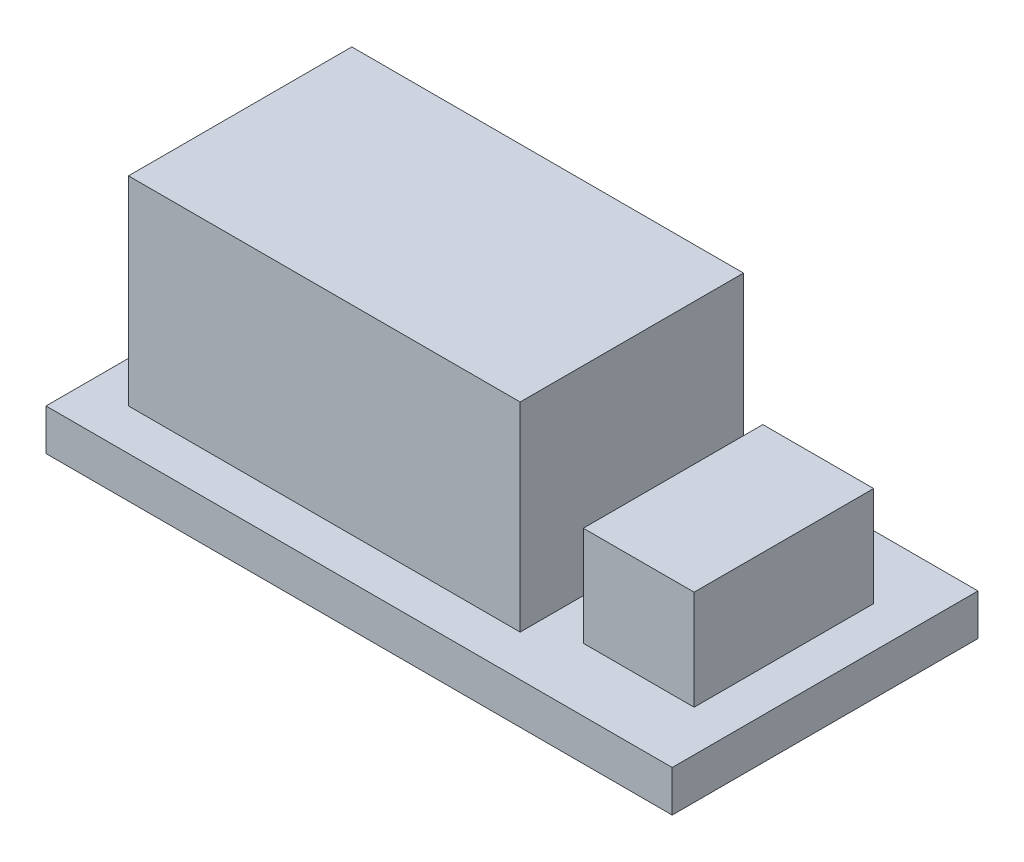
ISO-10303-21;
HEADER;
FILE_DESCRIPTION(('STEP AP214'),'2;1');
FILE_NAME('part.step','',(''),(''),'','','');
FILE_SCHEMA(('AUTOMOTIVE_DESIGN { 1 0 10303 214 1 1 1 1 }'));
ENDSEC;
DATA;
#1=APPLICATION_CONTEXT('core data for automotive mechanical design processes');
#2=APPLICATION_PROTOCOL_DEFINITION('international standard','automotive_design',2000,#1);
#3=PRODUCT_CONTEXT('',#1,'mechanical');
#4=PRODUCT('Part','Part','',(#3));
#5=PRODUCT_RELATED_PRODUCT_CATEGORY('part','',(#4));
#6=PRODUCT_DEFINITION_FORMATION('','',#4);
#7=PRODUCT_DEFINITION_CONTEXT('part definition',#1,'design');
#8=PRODUCT_DEFINITION('design','',#6,#7);
#9=PRODUCT_DEFINITION_SHAPE('','',#8);
#10=(LENGTH_UNIT() NAMED_UNIT(*) SI_UNIT(.MILLI.,.METRE.));
#11=(NAMED_UNIT(*) PLANE_ANGLE_UNIT() SI_UNIT($,.RADIAN.));
#12=(NAMED_UNIT(*) SI_UNIT($,.STERADIAN.) SOLID_ANGLE_UNIT());
#13=UNCERTAINTY_MEASURE_WITH_UNIT(LENGTH_MEASURE(1.E-05),#10,'distance_accuracy_value','');
#14=(GEOMETRIC_REPRESENTATION_CONTEXT(3) GLOBAL_UNCERTAINTY_ASSIGNED_CONTEXT((#13)) GLOBAL_UNIT_ASSIGNED_CONTEXT((#10,
#11,#12)) REPRESENTATION_CONTEXT('',''));
#15=CARTESIAN_POINT('',(0.,0.,0.));
#16=DIRECTION('',(0.,0.,1.));
#17=DIRECTION('',(1.,0.,0.));
#18=AXIS2_PLACEMENT_3D('',#15,#16,#17);
#19=CARTESIAN_POINT('',(2876.55,-304.8,1130.3));
#20=DIRECTION('',(-1.,0.,0.));
#21=DIRECTION('',(0.,0.,1.));
#22=AXIS2_PLACEMENT_3D('',#19,#20,#21);
#23=PLANE('',#22);
#24=DIRECTION('',(0.,0.,1.));
#25=VECTOR('',#24,1.);
#26=CARTESIAN_POINT('',(2876.55,0.,1130.3));
#27=LINE('',#26,#25);
#28=CARTESIAN_POINT('',(2876.55,0.,-1130.3));
#29=VERTEX_POINT('',#28);
#30=CARTESIAN_POINT('',(2876.55,0.,1130.3));
#31=VERTEX_POINT('',#30);
#32=EDGE_CURVE('E115',#29,#31,#27,.T.);
#33=ORIENTED_EDGE('',*,*,#32,.T.);
#34=DIRECTION('',(0.,1.,0.));
#35=VECTOR('',#34,1.);
#36=CARTESIAN_POINT('',(2876.55,-304.8,1130.3));
#37=LINE('',#36,#35);
#38=CARTESIAN_POINT('',(2876.55,-304.8,1130.3));
#39=VERTEX_POINT('',#38);
#40=EDGE_CURVE('E12',#39,#31,#37,.T.);
#41=ORIENTED_EDGE('',*,*,#40,.F.);
#42=DIRECTION('',(0.,0.,1.));
#43=VECTOR('',#42,1.);
#44=CARTESIAN_POINT('',(2876.55,-304.8,1130.3));
#45=LINE('',#44,#43);
#46=CARTESIAN_POINT('',(2876.55,-304.8,-1130.3));
#47=VERTEX_POINT('',#46);
#48=EDGE_CURVE('E103',#47,#39,#45,.T.);
#49=ORIENTED_EDGE('',*,*,#48,.F.);
#50=DIRECTION('',(0.,1.,0.));
#51=VECTOR('',#50,1.);
#52=CARTESIAN_POINT('',(2876.55,-304.8,-1130.3));
#53=LINE('',#52,#51);
#54=EDGE_CURVE('E111',#47,#29,#53,.T.);
#55=ORIENTED_EDGE('',*,*,#54,.T.);
#56=EDGE_LOOP('',(#33,#41,#49,#55));
#57=FACE_BOUND('',#56,.T.);
#58=ADVANCED_FACE('F52',(#57),#23,.F.);
#59=CARTESIAN_POINT('',(-1752.6,-304.8,1130.3));
#60=DIRECTION('',(0.,0.,-1.));
#61=DIRECTION('',(-1.,0.,0.));
#62=AXIS2_PLACEMENT_3D('',#59,#60,#61);
#63=PLANE('',#62);
#64=DIRECTION('',(-1.,0.,0.));
#65=VECTOR('',#64,1.);
#66=CARTESIAN_POINT('',(-1752.6,0.,1130.3));
#67=LINE('',#66,#65);
#68=CARTESIAN_POINT('',(-1752.6,0.,1130.3));
#69=VERTEX_POINT('',#68);
#70=EDGE_CURVE('E107',#31,#69,#67,.T.);
#71=ORIENTED_EDGE('',*,*,#70,.T.);
#72=DIRECTION('',(0.,1.,0.));
#73=VECTOR('',#72,1.);
#74=CARTESIAN_POINT('',(-1752.6,-304.8,1130.3));
#75=LINE('',#74,#73);
#76=CARTESIAN_POINT('',(-1752.6,-304.8,1130.3));
#77=VERTEX_POINT('',#76);
#78=EDGE_CURVE('E60',#77,#69,#75,.T.);
#79=ORIENTED_EDGE('',*,*,#78,.F.);
#80=DIRECTION('',(-1.,0.,0.));
#81=VECTOR('',#80,1.);
#82=CARTESIAN_POINT('',(-1752.6,-304.8,1130.3));
#83=LINE('',#82,#81);
#84=EDGE_CURVE('E98',#39,#77,#83,.T.);
#85=ORIENTED_EDGE('',*,*,#84,.F.);
#86=ORIENTED_EDGE('',*,*,#40,.T.);
#87=EDGE_LOOP('',(#71,#79,#85,#86));
#88=FACE_BOUND('',#87,.T.);
#89=ADVANCED_FACE('F106',(#88),#63,.F.);
#90=CARTESIAN_POINT('',(-1752.6,-304.8,1130.3));
#91=DIRECTION('',(1.,0.,0.));
#92=DIRECTION('',(0.,0.,-1.));
#93=AXIS2_PLACEMENT_3D('',#90,#91,#92);
#94=PLANE('',#93);
#95=DIRECTION('',(0.,0.,-1.));
#96=VECTOR('',#95,1.);
#97=CARTESIAN_POINT('',(-1752.6,0.,1130.3));
#98=LINE('',#97,#96);
#99=CARTESIAN_POINT('',(-1752.6,0.,-1130.3));
#100=VERTEX_POINT('',#99);
#101=EDGE_CURVE('E85',#69,#100,#98,.T.);
#102=ORIENTED_EDGE('',*,*,#101,.T.);
#103=DIRECTION('',(0.,1.,0.));
#104=VECTOR('',#103,1.);
#105=CARTESIAN_POINT('',(-1752.6,-304.8,-1130.3));
#106=LINE('',#105,#104);
#107=CARTESIAN_POINT('',(-1752.6,-304.8,-1130.3));
#108=VERTEX_POINT('',#107);
#109=EDGE_CURVE('E108',#108,#100,#106,.T.);
#110=ORIENTED_EDGE('',*,*,#109,.F.);
#111=DIRECTION('',(0.,0.,-1.));
#112=VECTOR('',#111,1.);
#113=CARTESIAN_POINT('',(-1752.6,-304.8,1130.3));
#114=LINE('',#113,#112);
#115=EDGE_CURVE('E101',#77,#108,#114,.T.);
#116=ORIENTED_EDGE('',*,*,#115,.F.);
#117=ORIENTED_EDGE('',*,*,#78,.T.);
#118=EDGE_LOOP('',(#102,#110,#116,#117));
#119=FACE_BOUND('',#118,.T.);
#120=ADVANCED_FACE('F109',(#119),#94,.F.);
#121=CARTESIAN_POINT('',(-1752.6,-304.8,-1130.3));
#122=DIRECTION('',(0.,0.,1.));
#123=DIRECTION('',(1.,0.,0.));
#124=AXIS2_PLACEMENT_3D('',#121,#122,#123);
#125=PLANE('',#124);
#126=DIRECTION('',(1.,0.,0.));
#127=VECTOR('',#126,1.);
#128=CARTESIAN_POINT('',(-1752.6,0.,-1130.3));
#129=LINE('',#128,#127);
#130=EDGE_CURVE('E91',#100,#29,#129,.T.);
#131=ORIENTED_EDGE('',*,*,#130,.T.);
#132=ORIENTED_EDGE('',*,*,#54,.F.);
#133=DIRECTION('',(1.,0.,0.));
#134=VECTOR('',#133,1.);
#135=CARTESIAN_POINT('',(-1752.6,-304.8,-1130.3));
#136=LINE('',#135,#134);
#137=EDGE_CURVE('E68',#108,#47,#136,.T.);
#138=ORIENTED_EDGE('',*,*,#137,.F.);
#139=ORIENTED_EDGE('',*,*,#109,.T.);
#140=EDGE_LOOP('',(#131,#132,#138,#139));
#141=FACE_BOUND('',#140,.T.);
#142=ADVANCED_FACE('F122',(#141),#125,.F.);
#143=CARTESIAN_POINT('',(0.,-304.8,0.));
#144=DIRECTION('',(0.,-1.,0.));
#145=DIRECTION('',(0.,0.,-1.));
#146=AXIS2_PLACEMENT_3D('',#143,#144,#145);
#147=PLANE('',#146);
#148=ORIENTED_EDGE('',*,*,#48,.T.);
#149=ORIENTED_EDGE('',*,*,#84,.T.);
#150=ORIENTED_EDGE('',*,*,#115,.T.);
#151=ORIENTED_EDGE('',*,*,#137,.T.);
#152=EDGE_LOOP('',(#148,#149,#150,#151));
#153=FACE_BOUND('',#152,.T.);
#154=ADVANCED_FACE('F99',(#153),#147,.T.);
#155=CARTESIAN_POINT('',(0.,0.,0.));
#156=DIRECTION('',(0.,-1.,0.));
#157=DIRECTION('',(0.,0.,-1.));
#158=AXIS2_PLACEMENT_3D('',#155,#156,#157);
#159=PLANE('',#158);
#160=ORIENTED_EDGE('',*,*,#32,.F.);
#161=ORIENTED_EDGE('',*,*,#130,.F.);
#162=ORIENTED_EDGE('',*,*,#101,.F.);
#163=ORIENTED_EDGE('',*,*,#70,.F.);
#164=EDGE_LOOP('',(#160,#161,#162,#163));
#165=FACE_BOUND('',#164,.T.);
#166=ADVANCED_FACE('F125',(#165),#159,.F.);
#167=CLOSED_SHELL('',(#58,#89,#120,#142,#154,#166));
#168=MANIFOLD_SOLID_BREP('B2',#167);
#169=CARTESIAN_POINT('',(2571.75,736.6,663.575000000001));
#170=DIRECTION('',(1.,0.,0.));
#171=DIRECTION('',(0.,0.,-1.));
#172=AXIS2_PLACEMENT_3D('',#169,#170,#171);
#173=PLANE('',#172);
#174=DIRECTION('',(0.,0.,1.));
#175=VECTOR('',#174,1.);
#176=CARTESIAN_POINT('',(2571.75,0.,663.575000000001));
#177=LINE('',#176,#175);
#178=CARTESIAN_POINT('',(2571.75,0.,-663.575));
#179=VERTEX_POINT('',#178);
#180=CARTESIAN_POINT('',(2571.75,0.,663.575000000001));
#181=VERTEX_POINT('',#180);
#182=EDGE_CURVE('E251',#179,#181,#177,.T.);
#183=ORIENTED_EDGE('',*,*,#182,.F.);
#184=DIRECTION('',(0.,-1.,0.));
#185=VECTOR('',#184,1.);
#186=CARTESIAN_POINT('',(2571.75,736.6,-663.575));
#187=LINE('',#186,#185);
#188=CARTESIAN_POINT('',(2571.75,736.6,-663.575));
#189=VERTEX_POINT('',#188);
#190=EDGE_CURVE('E50',#189,#179,#187,.T.);
#191=ORIENTED_EDGE('',*,*,#190,.F.);
#192=DIRECTION('',(0.,0.,1.));
#193=VECTOR('',#192,1.);
#194=CARTESIAN_POINT('',(2571.75,736.6,663.575000000001));
#195=LINE('',#194,#193);
#196=CARTESIAN_POINT('',(2571.75,736.6,663.575000000001));
#197=VERTEX_POINT('',#196);
#198=EDGE_CURVE('E245',#189,#197,#195,.T.);
#199=ORIENTED_EDGE('',*,*,#198,.T.);
#200=DIRECTION('',(0.,-1.,0.));
#201=VECTOR('',#200,1.);
#202=CARTESIAN_POINT('',(2571.75,736.6,663.575000000001));
#203=LINE('',#202,#201);
#204=EDGE_CURVE('E190',#197,#181,#203,.T.);
#205=ORIENTED_EDGE('',*,*,#204,.T.);
#206=EDGE_LOOP('',(#183,#191,#199,#205));
#207=FACE_BOUND('',#206,.T.);
#208=ADVANCED_FACE('F187',(#207),#173,.T.);
#209=CARTESIAN_POINT('',(1752.6,736.6,-663.575));
#210=DIRECTION('',(0.,0.,-1.));
#211=DIRECTION('',(-1.,0.,0.));
#212=AXIS2_PLACEMENT_3D('',#209,#210,#211);
#213=PLANE('',#212);
#214=DIRECTION('',(1.,0.,0.));
#215=VECTOR('',#214,1.);
#216=CARTESIAN_POINT('',(1752.6,0.,-663.575));
#217=LINE('',#216,#215);
#218=CARTESIAN_POINT('',(1752.6,0.,-663.575));
#219=VERTEX_POINT('',#218);
#220=EDGE_CURVE('E247',#219,#179,#217,.T.);
#221=ORIENTED_EDGE('',*,*,#220,.F.);
#222=DIRECTION('',(0.,-1.,0.));
#223=VECTOR('',#222,1.);
#224=CARTESIAN_POINT('',(1752.6,736.6,-663.575));
#225=LINE('',#224,#223);
#226=CARTESIAN_POINT('',(1752.6,736.6,-663.575));
#227=VERTEX_POINT('',#226);
#228=EDGE_CURVE('E196',#227,#219,#225,.T.);
#229=ORIENTED_EDGE('',*,*,#228,.F.);
#230=DIRECTION('',(1.,0.,0.));
#231=VECTOR('',#230,1.);
#232=CARTESIAN_POINT('',(1752.6,736.6,-663.575));
#233=LINE('',#232,#231);
#234=EDGE_CURVE('E242',#227,#189,#233,.T.);
#235=ORIENTED_EDGE('',*,*,#234,.T.);
#236=ORIENTED_EDGE('',*,*,#190,.T.);
#237=EDGE_LOOP('',(#221,#229,#235,#236));
#238=FACE_BOUND('',#237,.T.);
#239=ADVANCED_FACE('F261',(#238),#213,.T.);
#240=CARTESIAN_POINT('',(1752.6,736.6,663.575));
#241=DIRECTION('',(-1.,0.,0.));
#242=DIRECTION('',(0.,0.,1.));
#243=AXIS2_PLACEMENT_3D('',#240,#241,#242);
#244=PLANE('',#243);
#245=DIRECTION('',(0.,0.,-1.));
#246=VECTOR('',#245,1.);
#247=CARTESIAN_POINT('',(1752.6,0.,663.575));
#248=LINE('',#247,#246);
#249=CARTESIAN_POINT('',(1752.6,0.,663.575));
#250=VERTEX_POINT('',#249);
#251=EDGE_CURVE('E237',#250,#219,#248,.T.);
#252=ORIENTED_EDGE('',*,*,#251,.F.);
#253=DIRECTION('',(0.,-1.,0.));
#254=VECTOR('',#253,1.);
#255=CARTESIAN_POINT('',(1752.6,736.6,663.575));
#256=LINE('',#255,#254);
#257=CARTESIAN_POINT('',(1752.6,736.6,663.575));
#258=VERTEX_POINT('',#257);
#259=EDGE_CURVE('E232',#258,#250,#256,.T.);
#260=ORIENTED_EDGE('',*,*,#259,.F.);
#261=DIRECTION('',(0.,0.,-1.));
#262=VECTOR('',#261,1.);
#263=CARTESIAN_POINT('',(1752.6,736.6,663.575));
#264=LINE('',#263,#262);
#265=EDGE_CURVE('E235',#258,#227,#264,.T.);
#266=ORIENTED_EDGE('',*,*,#265,.T.);
#267=ORIENTED_EDGE('',*,*,#228,.T.);
#268=EDGE_LOOP('',(#252,#260,#266,#267));
#269=FACE_BOUND('',#268,.T.);
#270=ADVANCED_FACE('F234',(#269),#244,.T.);
#271=CARTESIAN_POINT('',(1752.6,736.6,663.575));
#272=DIRECTION('',(0.,0.,1.));
#273=DIRECTION('',(1.,0.,0.));
#274=AXIS2_PLACEMENT_3D('',#271,#272,#273);
#275=PLANE('',#274);
#276=DIRECTION('',(-1.,0.,0.));
#277=VECTOR('',#276,1.);
#278=CARTESIAN_POINT('',(1752.6,0.,663.575));
#279=LINE('',#278,#277);
#280=EDGE_CURVE('E254',#181,#250,#279,.T.);
#281=ORIENTED_EDGE('',*,*,#280,.F.);
#282=ORIENTED_EDGE('',*,*,#204,.F.);
#283=DIRECTION('',(-1.,0.,0.));
#284=VECTOR('',#283,1.);
#285=CARTESIAN_POINT('',(1752.6,736.6,663.575));
#286=LINE('',#285,#284);
#287=EDGE_CURVE('E241',#197,#258,#286,.T.);
#288=ORIENTED_EDGE('',*,*,#287,.T.);
#289=ORIENTED_EDGE('',*,*,#259,.T.);
#290=EDGE_LOOP('',(#281,#282,#288,#289));
#291=FACE_BOUND('',#290,.T.);
#292=ADVANCED_FACE('F244',(#291),#275,.T.);
#293=CARTESIAN_POINT('',(0.,736.6,0.));
#294=DIRECTION('',(0.,-1.,0.));
#295=DIRECTION('',(0.,0.,-1.));
#296=AXIS2_PLACEMENT_3D('',#293,#294,#295);
#297=PLANE('',#296);
#298=ORIENTED_EDGE('',*,*,#198,.F.);
#299=ORIENTED_EDGE('',*,*,#234,.F.);
#300=ORIENTED_EDGE('',*,*,#265,.F.);
#301=ORIENTED_EDGE('',*,*,#287,.F.);
#302=EDGE_LOOP('',(#298,#299,#300,#301));
#303=FACE_BOUND('',#302,.T.);
#304=ADVANCED_FACE('F240',(#303),#297,.F.);
#305=CARTESIAN_POINT('',(0.,0.,0.));
#306=DIRECTION('',(0.,-1.,0.));
#307=DIRECTION('',(0.,0.,-1.));
#308=AXIS2_PLACEMENT_3D('',#305,#306,#307);
#309=PLANE('',#308);
#310=ORIENTED_EDGE('',*,*,#182,.T.);
#311=ORIENTED_EDGE('',*,*,#280,.T.);
#312=ORIENTED_EDGE('',*,*,#251,.T.);
#313=ORIENTED_EDGE('',*,*,#220,.T.);
#314=EDGE_LOOP('',(#310,#311,#312,#313));
#315=FACE_BOUND('',#314,.T.);
#316=ADVANCED_FACE('F260',(#315),#309,.T.);
#317=CLOSED_SHELL('',(#208,#239,#270,#292,#304,#316));
#318=MANIFOLD_SOLID_BREP('B6',#317);
#319=CARTESIAN_POINT('',(1447.8,1473.2,-825.5));
#320=DIRECTION('',(-1.,0.,0.));
#321=DIRECTION('',(0.,0.,1.));
#322=AXIS2_PLACEMENT_3D('',#319,#320,#321);
#323=PLANE('',#322);
#324=DIRECTION('',(0.,0.,-1.));
#325=VECTOR('',#324,1.);
#326=CARTESIAN_POINT('',(1447.8,0.,-825.5));
#327=LINE('',#326,#325);
#328=CARTESIAN_POINT('',(1447.8,0.,825.5));
#329=VERTEX_POINT('',#328);
#330=CARTESIAN_POINT('',(1447.8,0.,-825.5));
#331=VERTEX_POINT('',#330);
#332=EDGE_CURVE('E374',#329,#331,#327,.T.);
#333=ORIENTED_EDGE('',*,*,#332,.T.);
#334=DIRECTION('',(0.,-1.,0.));
#335=VECTOR('',#334,1.);
#336=CARTESIAN_POINT('',(1447.8,1473.2,-825.5));
#337=LINE('',#336,#335);
#338=CARTESIAN_POINT('',(1447.8,1473.2,-825.5));
#339=VERTEX_POINT('',#338);
#340=EDGE_CURVE('E185',#339,#331,#337,.T.);
#341=ORIENTED_EDGE('',*,*,#340,.F.);
#342=DIRECTION('',(0.,0.,-1.));
#343=VECTOR('',#342,1.);
#344=CARTESIAN_POINT('',(1447.8,1473.2,-825.5));
#345=LINE('',#344,#343);
#346=CARTESIAN_POINT('',(1447.8,1473.2,825.5));
#347=VERTEX_POINT('',#346);
#348=EDGE_CURVE('E362',#347,#339,#345,.T.);
#349=ORIENTED_EDGE('',*,*,#348,.F.);
#350=DIRECTION('',(0.,-1.,0.));
#351=VECTOR('',#350,1.);
#352=CARTESIAN_POINT('',(1447.8,1473.2,825.5));
#353=LINE('',#352,#351);
#354=EDGE_CURVE('E370',#347,#329,#353,.T.);
#355=ORIENTED_EDGE('',*,*,#354,.T.);
#356=EDGE_LOOP('',(#333,#341,#349,#355));
#357=FACE_BOUND('',#356,.T.);
#358=ADVANCED_FACE('F311',(#357),#323,.F.);
#359=CARTESIAN_POINT('',(-1447.8,1473.2,-825.5));
#360=DIRECTION('',(0.,0.,1.));
#361=DIRECTION('',(1.,0.,0.));
#362=AXIS2_PLACEMENT_3D('',#359,#360,#361);
#363=PLANE('',#362);
#364=DIRECTION('',(-1.,0.,0.));
#365=VECTOR('',#364,1.);
#366=CARTESIAN_POINT('',(-1447.8,0.,-825.5));
#367=LINE('',#366,#365);
#368=CARTESIAN_POINT('',(-1447.8,0.,-825.5));
#369=VERTEX_POINT('',#368);
#370=EDGE_CURVE('E366',#331,#369,#367,.T.);
#371=ORIENTED_EDGE('',*,*,#370,.T.);
#372=DIRECTION('',(0.,-1.,0.));
#373=VECTOR('',#372,1.);
#374=CARTESIAN_POINT('',(-1447.8,1473.2,-825.5));
#375=LINE('',#374,#373);
#376=CARTESIAN_POINT('',(-1447.8,1473.2,-825.5));
#377=VERTEX_POINT('',#376);
#378=EDGE_CURVE('E319',#377,#369,#375,.T.);
#379=ORIENTED_EDGE('',*,*,#378,.F.);
#380=DIRECTION('',(-1.,0.,0.));
#381=VECTOR('',#380,1.);
#382=CARTESIAN_POINT('',(-1447.8,1473.2,-825.5));
#383=LINE('',#382,#381);
#384=EDGE_CURVE('E357',#339,#377,#383,.T.);
#385=ORIENTED_EDGE('',*,*,#384,.F.);
#386=ORIENTED_EDGE('',*,*,#340,.T.);
#387=EDGE_LOOP('',(#371,#379,#385,#386));
#388=FACE_BOUND('',#387,.T.);
#389=ADVANCED_FACE('F365',(#388),#363,.F.);
#390=CARTESIAN_POINT('',(-1447.8,1473.2,-825.5));
#391=DIRECTION('',(1.,0.,0.));
#392=DIRECTION('',(0.,0.,-1.));
#393=AXIS2_PLACEMENT_3D('',#390,#391,#392);
#394=PLANE('',#393);
#395=DIRECTION('',(0.,0.,1.));
#396=VECTOR('',#395,1.);
#397=CARTESIAN_POINT('',(-1447.8,0.,-825.5));
#398=LINE('',#397,#396);
#399=CARTESIAN_POINT('',(-1447.8,0.,825.5));
#400=VERTEX_POINT('',#399);
#401=EDGE_CURVE('E344',#369,#400,#398,.T.);
#402=ORIENTED_EDGE('',*,*,#401,.T.);
#403=DIRECTION('',(0.,-1.,0.));
#404=VECTOR('',#403,1.);
#405=CARTESIAN_POINT('',(-1447.8,1473.2,825.5));
#406=LINE('',#405,#404);
#407=CARTESIAN_POINT('',(-1447.8,1473.2,825.5));
#408=VERTEX_POINT('',#407);
#409=EDGE_CURVE('E367',#408,#400,#406,.T.);
#410=ORIENTED_EDGE('',*,*,#409,.F.);
#411=DIRECTION('',(0.,0.,1.));
#412=VECTOR('',#411,1.);
#413=CARTESIAN_POINT('',(-1447.8,1473.2,-825.5));
#414=LINE('',#413,#412);
#415=EDGE_CURVE('E360',#377,#408,#414,.T.);
#416=ORIENTED_EDGE('',*,*,#415,.F.);
#417=ORIENTED_EDGE('',*,*,#378,.T.);
#418=EDGE_LOOP('',(#402,#410,#416,#417));
#419=FACE_BOUND('',#418,.T.);
#420=ADVANCED_FACE('F368',(#419),#394,.F.);
#421=CARTESIAN_POINT('',(-1447.8,1473.2,825.5));
#422=DIRECTION('',(0.,0.,-1.));
#423=DIRECTION('',(-1.,0.,0.));
#424=AXIS2_PLACEMENT_3D('',#421,#422,#423);
#425=PLANE('',#424);
#426=DIRECTION('',(1.,0.,0.));
#427=VECTOR('',#426,1.);
#428=CARTESIAN_POINT('',(-1447.8,0.,825.5));
#429=LINE('',#428,#427);
#430=EDGE_CURVE('E350',#400,#329,#429,.T.);
#431=ORIENTED_EDGE('',*,*,#430,.T.);
#432=ORIENTED_EDGE('',*,*,#354,.F.);
#433=DIRECTION('',(1.,0.,0.));
#434=VECTOR('',#433,1.);
#435=CARTESIAN_POINT('',(-1447.8,1473.2,825.5));
#436=LINE('',#435,#434);
#437=EDGE_CURVE('E327',#408,#347,#436,.T.);
#438=ORIENTED_EDGE('',*,*,#437,.F.);
#439=ORIENTED_EDGE('',*,*,#409,.T.);
#440=EDGE_LOOP('',(#431,#432,#438,#439));
#441=FACE_BOUND('',#440,.T.);
#442=ADVANCED_FACE('F381',(#441),#425,.F.);
#443=CARTESIAN_POINT('',(0.,1473.2,0.));
#444=DIRECTION('',(0.,1.,0.));
#445=DIRECTION('',(0.,0.,1.));
#446=AXIS2_PLACEMENT_3D('',#443,#444,#445);
#447=PLANE('',#446);
#448=ORIENTED_EDGE('',*,*,#348,.T.);
#449=ORIENTED_EDGE('',*,*,#384,.T.);
#450=ORIENTED_EDGE('',*,*,#415,.T.);
#451=ORIENTED_EDGE('',*,*,#437,.T.);
#452=EDGE_LOOP('',(#448,#449,#450,#451));
#453=FACE_BOUND('',#452,.T.);
#454=ADVANCED_FACE('F358',(#453),#447,.T.);
#455=CARTESIAN_POINT('',(0.,0.,0.));
#456=DIRECTION('',(0.,1.,0.));
#457=DIRECTION('',(0.,0.,1.));
#458=AXIS2_PLACEMENT_3D('',#455,#456,#457);
#459=PLANE('',#458);
#460=ORIENTED_EDGE('',*,*,#332,.F.);
#461=ORIENTED_EDGE('',*,*,#430,.F.);
#462=ORIENTED_EDGE('',*,*,#401,.F.);
#463=ORIENTED_EDGE('',*,*,#370,.F.);
#464=EDGE_LOOP('',(#460,#461,#462,#463));
#465=FACE_BOUND('',#464,.T.);
#466=ADVANCED_FACE('F384',(#465),#459,.F.);
#467=CLOSED_SHELL('',(#358,#389,#420,#442,#454,#466));
#468=MANIFOLD_SOLID_BREP('B44',#467);
#469=ADVANCED_BREP_SHAPE_REPRESENTATION('',(#18,#168,#318,#468),#14);
#470=SHAPE_DEFINITION_REPRESENTATION(#9,#469);
ENDSEC;
END-ISO-10303-21;
